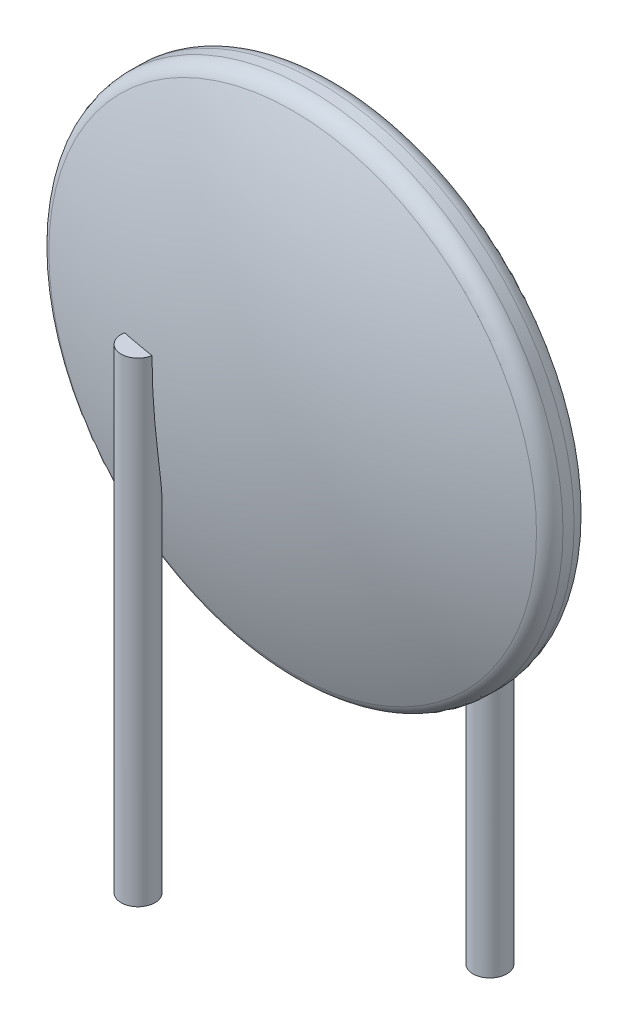
ISO-10303-21;
HEADER;
FILE_DESCRIPTION(('STEP AP214'),'2;1');
FILE_NAME('part.step','',(''),(''),'','','');
FILE_SCHEMA(('AUTOMOTIVE_DESIGN { 1 0 10303 214 1 1 1 1 }'));
ENDSEC;
DATA;
#1=APPLICATION_CONTEXT('core data for automotive mechanical design processes');
#2=APPLICATION_PROTOCOL_DEFINITION('international standard','automotive_design',2000,#1);
#3=PRODUCT_CONTEXT('',#1,'mechanical');
#4=PRODUCT('Part','Part','',(#3));
#5=PRODUCT_RELATED_PRODUCT_CATEGORY('part','',(#4));
#6=PRODUCT_DEFINITION_FORMATION('','',#4);
#7=PRODUCT_DEFINITION_CONTEXT('part definition',#1,'design');
#8=PRODUCT_DEFINITION('design','',#6,#7);
#9=PRODUCT_DEFINITION_SHAPE('','',#8);
#10=(LENGTH_UNIT() NAMED_UNIT(*) SI_UNIT(.MILLI.,.METRE.));
#11=(NAMED_UNIT(*) PLANE_ANGLE_UNIT() SI_UNIT($,.RADIAN.));
#12=(NAMED_UNIT(*) SI_UNIT($,.STERADIAN.) SOLID_ANGLE_UNIT());
#13=UNCERTAINTY_MEASURE_WITH_UNIT(LENGTH_MEASURE(1.E-05),#10,'distance_accuracy_value','');
#14=(GEOMETRIC_REPRESENTATION_CONTEXT(3) GLOBAL_UNCERTAINTY_ASSIGNED_CONTEXT((#13)) GLOBAL_UNIT_ASSIGNED_CONTEXT((#10,
#11,#12)) REPRESENTATION_CONTEXT('',''));
#15=CARTESIAN_POINT('',(0.,0.,0.));
#16=DIRECTION('',(0.,0.,1.));
#17=DIRECTION('',(1.,0.,0.));
#18=AXIS2_PLACEMENT_3D('',#15,#16,#17);
#19=CARTESIAN_POINT('',(0.,-14.,0.));
#20=DIRECTION('',(0.,1.,0.));
#21=DIRECTION('',(0.,0.,1.));
#22=AXIS2_PLACEMENT_3D('',#19,#20,#21);
#23=PLANE('',#22);
#24=CARTESIAN_POINT('',(-3.5,-14.,3.683326093251));
#25=DIRECTION('',(0.,1.,0.));
#26=DIRECTION('',(0.,0.,1.));
#27=AXIS2_PLACEMENT_3D('',#24,#25,#26);
#28=CIRCLE('',#27,0.5);
#29=CARTESIAN_POINT('',(-3.5,-14.,4.183326093251));
#30=VERTEX_POINT('',#29);
#31=EDGE_CURVE('E66',#30,#30,#28,.T.);
#32=ORIENTED_EDGE('',*,*,#31,.F.);
#33=EDGE_LOOP('',(#32));
#34=FACE_BOUND('',#33,.T.);
#35=ADVANCED_FACE('F17',(#34),#23,.F.);
#36=CARTESIAN_POINT('',(-3.5,0.,3.683326093251));
#37=DIRECTION('',(0.,1.,0.));
#38=DIRECTION('',(0.,0.,1.));
#39=AXIS2_PLACEMENT_3D('',#36,#37,#38);
#40=CYLINDRICAL_SURFACE('',#39,0.5);
#41=ORIENTED_EDGE('',*,*,#31,.T.);
#42=EDGE_LOOP('',(#41));
#43=FACE_BOUND('',#42,.T.);
#44=CARTESIAN_POINT('',(-3.5,0.,3.683326093251));
#45=DIRECTION('',(0.,1.,0.));
#46=DIRECTION('',(0.,0.,1.));
#47=AXIS2_PLACEMENT_3D('',#44,#45,#46);
#48=CIRCLE('',#47,0.5);
#49=CARTESIAN_POINT('',(-3.9906891716571,0.,3.58728372333819));
#50=VERTEX_POINT('',#49);
#51=CARTESIAN_POINT('',(-3.00700971065829,0.,3.7667561514721));
#52=VERTEX_POINT('',#51);
#53=EDGE_CURVE('E55',#50,#52,#48,.T.);
#54=ORIENTED_EDGE('',*,*,#53,.F.);
#55=CARTESIAN_POINT('',(-3.00700971065708,0.,3.76675615146499));
#56=CARTESIAN_POINT('',(-3.0070592251256,-0.239811081678179,3.76674767890379));
#57=CARTESIAN_POINT('',(-3.00621259813311,-0.47956267850901,3.76240351238254));
#58=CARTESIAN_POINT('',(-3.00486541035755,-0.739302566449599,3.75291203893592));
#59=CARTESIAN_POINT('',(-3.00475813433634,-0.759444701510805,3.75214478190955));
#60=CARTESIAN_POINT('',(-3.00371758637981,-0.950353461816241,3.74457628746463));
#61=CARTESIAN_POINT('',(-3.00260692799845,-1.1210384372399,3.73556171186832));
#62=CARTESIAN_POINT('',(-3.00074793856268,-1.46214826812452,3.71293470598278));
#63=CARTESIAN_POINT('',(-2.99999970037394,-1.63257304577325,3.69932109876417));
#64=CARTESIAN_POINT('',(-3.00000029243504,-1.96889336274183,3.66771496831553));
#65=CARTESIAN_POINT('',(-3.00071362398686,-2.13479943900794,3.64983538064774));
#66=CARTESIAN_POINT('',(-3.00507921327714,-2.46588005285264,3.60933607712852));
#67=CARTESIAN_POINT('',(-3.00872908139309,-2.63105507548263,3.58672022650128));
#68=CARTESIAN_POINT('',(-3.01821481682134,-2.87811458150513,3.54898399723995));
#69=CARTESIAN_POINT('',(-3.02204640036418,-2.96036717114189,3.53576678109421));
#70=CARTESIAN_POINT('',(-3.03151719165963,-3.12457712849024,3.50799513472799));
#71=CARTESIAN_POINT('',(-3.03715701972241,-3.20653438511846,3.49344024684927));
#72=CARTESIAN_POINT('',(-3.05091864377237,-3.37032626654175,3.46285355029595));
#73=CARTESIAN_POINT('',(-3.05905074560314,-3.45215893686018,3.44681580583883));
#74=CARTESIAN_POINT('',(-3.07878239084277,-3.61503999402156,3.41321197641178));
#75=CARTESIAN_POINT('',(-3.09037859727499,-3.69608905849256,3.39564737375956));
#76=CARTESIAN_POINT('',(-3.11184454356201,-3.81695800105449,3.36793662824601));
#77=CARTESIAN_POINT('',(-3.11971480762932,-3.85727636304615,3.35843512303434));
#78=CARTESIAN_POINT('',(-3.13727409136442,-3.93747520029394,3.33893796833622));
#79=CARTESIAN_POINT('',(-3.14696617635211,-3.97735481584789,3.32894150724827));
#80=CARTESIAN_POINT('',(-3.16878323283047,-4.05613980448162,3.30846373861619));
#81=CARTESIAN_POINT('',(-3.18089657797682,-4.09504887025657,3.29798492555423));
#82=CARTESIAN_POINT('',(-3.20186001523362,-4.15221594245889,3.28184323045006));
#83=CARTESIAN_POINT('',(-3.20930209509203,-4.17104887213027,3.27639932268348));
#84=CARTESIAN_POINT('',(-3.22540650170287,-4.20813447228723,3.26536158109414));
#85=CARTESIAN_POINT('',(-3.23406777516335,-4.22638762714502,3.25976788002425));
#86=CARTESIAN_POINT('',(-3.25312380788255,-4.26213971583301,3.24838122078578));
#87=CARTESIAN_POINT('',(-3.26353370635039,-4.27963021829741,3.24258690755146));
#88=CARTESIAN_POINT('',(-3.28672073449018,-4.31288416996103,3.23090857008006));
#89=CARTESIAN_POINT('',(-3.29948036727393,-4.32865909632307,3.22502548617287));
#90=CARTESIAN_POINT('',(-3.31955734534966,-4.34800213451734,3.21698376361311));
#91=CARTESIAN_POINT('',(-3.32536803746215,-4.35309150931643,3.21476920198868));
#92=CARTESIAN_POINT('',(-3.33759242679954,-4.36253986182098,3.21039248976587));
#93=CARTESIAN_POINT('',(-3.34400654321607,-4.36689832583493,3.20823037693429));
#94=CARTESIAN_POINT('',(-3.35756226748898,-4.3746514801246,3.20399065412846));
#95=CARTESIAN_POINT('',(-3.36471271159778,-4.37803200409085,3.20191462686344));
#96=CARTESIAN_POINT('',(-3.37957139664478,-4.38336607187798,3.19798558187876));
#97=CARTESIAN_POINT('',(-3.38727730958809,-4.38532522945285,3.19613171124764));
#98=CARTESIAN_POINT('',(-3.40232157865398,-4.38743236552548,3.192905072486));
#99=CARTESIAN_POINT('',(-3.40963337258014,-4.38772340974107,3.19150444574472));
#100=CARTESIAN_POINT('',(-3.42422645557374,-4.38683290716573,3.18904559422415));
#101=CARTESIAN_POINT('',(-3.43150772041902,-4.38565035531601,3.18798760375855));
#102=CARTESIAN_POINT('',(-3.44611237088132,-4.38189488193341,3.18618118329614));
#103=CARTESIAN_POINT('',(-3.45342078704104,-4.37925753054465,3.18545018414062));
#104=CARTESIAN_POINT('',(-3.46756901292992,-4.37286016529801,3.18432819396264));
#105=CARTESIAN_POINT('',(-3.47440709490322,-4.3690962584545,3.18393840066522));
#106=CARTESIAN_POINT('',(-3.49164508034788,-4.3581601746311,3.18328166455783));
#107=CARTESIAN_POINT('',(-3.50162462597661,-4.35032174884782,3.18324074142936));
#108=CARTESIAN_POINT('',(-3.52039777793067,-4.33336302052713,3.18365396752202));
#109=CARTESIAN_POINT('',(-3.52918820988885,-4.32423941457886,3.18410941359464));
#110=CARTESIAN_POINT('',(-3.54892956219623,-4.30162658896557,3.18559364554635));
#111=CARTESIAN_POINT('',(-3.55945656160757,-4.28778212623761,3.18677327934215));
#112=CARTESIAN_POINT('',(-3.57916716256999,-4.25924786462843,3.1895337835462));
#113=CARTESIAN_POINT('',(-3.58835147840559,-4.24455852104766,3.19111443938434));
#114=CARTESIAN_POINT('',(-3.60576273704294,-4.21452868236506,3.19455881055538));
#115=CARTESIAN_POINT('',(-3.61398289232902,-4.19918450044662,3.19642434193278));
#116=CARTESIAN_POINT('',(-3.62960544966064,-4.16811863599027,3.20034913058356));
#117=CARTESIAN_POINT('',(-3.63700799904977,-4.1523970220944,3.20240835282698));
#118=CARTESIAN_POINT('',(-3.661489771501,-4.09754095607482,3.2097702055319));
#119=CARTESIAN_POINT('',(-3.67692512103995,-4.05772190264304,3.21542050362153));
#120=CARTESIAN_POINT('',(-3.70521087315429,-3.97719004605075,3.22712559242495));
#121=CARTESIAN_POINT('',(-3.71805631213925,-3.9364756895041,3.23318113076562));
#122=CARTESIAN_POINT('',(-3.74183036469748,-3.85448337384378,3.24549344081269));
#123=CARTESIAN_POINT('',(-3.75275719008664,-3.81320492719506,3.25175039388305));
#124=CARTESIAN_POINT('',(-3.77315954362059,-3.73011052649499,3.26436573405893));
#125=CARTESIAN_POINT('',(-3.7826283021768,-3.68829298768148,3.27072445142253));
#126=CARTESIAN_POINT('',(-3.80033528181156,-3.60445600567161,3.28342945207206));
#127=CARTESIAN_POINT('',(-3.80857507850008,-3.56243689354158,3.28977574080324));
#128=CARTESIAN_POINT('',(-3.82403725464052,-3.478228086016,3.30240782995834));
#129=CARTESIAN_POINT('',(-3.83126016545708,-3.43603849165001,3.30869366036229));
#130=CARTESIAN_POINT('',(-3.85657424680537,-3.27869291574557,3.33191122957267));
#131=CARTESIAN_POINT('',(-3.87195111299003,-3.16305215688407,3.3485269439002));
#132=CARTESIAN_POINT('',(-3.89843511619183,-2.93104497680271,3.38054775972907));
#133=CARTESIAN_POINT('',(-3.90953861228295,-2.814678022253,3.39595182004707));
#134=CARTESIAN_POINT('',(-3.9286280214154,-2.58134867680332,3.4252861251406));
#135=CARTESIAN_POINT('',(-3.9366097579127,-2.46438569886034,3.43921437743071));
#136=CARTESIAN_POINT('',(-3.9502522842617,-2.23001009198165,3.46540348512106));
#137=CARTESIAN_POINT('',(-3.95591046721884,-2.11259710636215,3.47766245743744));
#138=CARTESIAN_POINT('',(-3.96548772179966,-1.87745421440414,3.50036989277371));
#139=CARTESIAN_POINT('',(-3.9694057253901,-1.75972415793005,3.51081724152068));
#140=CARTESIAN_POINT('',(-3.97571851964819,-1.53239040314244,3.52912298006539));
#141=CARTESIAN_POINT('',(-3.97820129489153,-1.42279956950946,3.53711204771452));
#142=CARTESIAN_POINT('',(-3.98232938500204,-1.20356408155124,3.5513660693275));
#143=CARTESIAN_POINT('',(-3.9839752600979,-1.09391951254009,3.55763217536398));
#144=CARTESIAN_POINT('',(-3.98664247302107,-0.874692910352454,3.56839329419133));
#145=CARTESIAN_POINT('',(-3.98766469849102,-0.765111011120696,3.57289082094872));
#146=CARTESIAN_POINT('',(-3.9892400442422,-0.546126212535176,3.58008609734823));
#147=CARTESIAN_POINT('',(-3.98979419186315,-0.436723449925064,3.58278778571224));
#148=CARTESIAN_POINT('',(-3.99051286824745,-0.21821372826253,3.58638507171146));
#149=CARTESIAN_POINT('',(-3.99067855546026,-0.109106861386445,3.58728603819117));
#150=CARTESIAN_POINT('',(-3.99068917165713,0.,3.58728372333839));
#151=B_SPLINE_CURVE_WITH_KNOTS('',3,(#55,#56,#57,#58,#59,#60,#61,#62,#63,#64,#65,#66,#67,#68,
#69,#70,#71,#72,#73,#74,#75,#76,#77,#78,#79,#80,#81,#82,#83,#84,#85,#86,#87,#88,#89,#90,#91,#92,
#93,#94,#95,#96,#97,#98,#99,#100,#101,#102,#103,#104,#105,#106,#107,#108,#109,#110,#111,#112,
#113,#114,#115,#116,#117,#118,#119,#120,#121,#122,#123,#124,#125,#126,#127,#128,#129,#130,#131,
#132,#133,#134,#135,#136,#137,#138,#139,#140,#141,#142,#143,#144,#145,#146,#147,#148,#149,#150),
.UNSPECIFIED.,.F.,.F.,(4,2,2,2,2,2,2,2,2,2,2,2,2,2,2,2,2,2,2,2,2,2,2,2,2,2,2,2,2,2,2,2,2,2,2,2,
2,2,2,2,2,2,2,2,2,2,2,4),(0.,0.719281678061737,0.779752706889144,1.29246368290507,
1.80530596532201,2.30584001867302,2.80596717120091,3.05613212986983,3.30638299849169,
3.5576829744634,3.8087416491993,3.93519947376343,4.06187200709235,4.18795029975535,
4.25082871153622,4.31365313072566,4.37705251132463,4.4399976035835,4.46406227900844,
4.48814379708774,4.51255844428998,4.53687613181244,4.5590728532389,4.58128472211722,
4.60457001195081,4.62793671541105,4.66579138542015,4.70374519499999,4.75591410950639,
4.80805516926266,4.86054368334885,4.91302272281175,5.04208836773961,5.17139906503013,
5.30082964989465,5.43084413248858,5.56069046805111,5.69046869971647,6.0438312305973,
6.39749416457846,6.75162865218117,7.10615938006337,7.46090740113472,7.79061954282076,
8.12011068062717,8.44913175179344,8.77742879540575,9.10474555388431),.UNSPECIFIED.);
#152=EDGE_CURVE('E58',#52,#50,#151,.T.);
#153=ORIENTED_EDGE('',*,*,#152,.F.);
#154=EDGE_LOOP('',(#54,#153));
#155=FACE_BOUND('',#154,.T.);
#156=ADVANCED_FACE('F59',(#43,#155),#40,.T.);
#157=CARTESIAN_POINT('',(0.,0.,0.));
#158=DIRECTION('',(0.,1.,0.));
#159=DIRECTION('',(0.,0.,1.));
#160=AXIS2_PLACEMENT_3D('',#157,#158,#159);
#161=PLANE('',#160);
#162=ORIENTED_EDGE('',*,*,#53,.T.);
#163=CARTESIAN_POINT('',(0.,0.,-15.5));
#164=DIRECTION('',(0.,1.,0.));
#165=DIRECTION('',(0.,0.,1.));
#166=AXIS2_PLACEMENT_3D('',#163,#164,#165);
#167=CIRCLE('',#166,19.5);
#168=EDGE_CURVE('E62',#50,#52,#167,.T.);
#169=ORIENTED_EDGE('',*,*,#168,.F.);
#170=EDGE_LOOP('',(#162,#169));
#171=FACE_BOUND('',#170,.T.);
#172=ADVANCED_FACE('F65',(#171),#161,.T.);
#173=CARTESIAN_POINT('',(0.,0.,-15.5));
#174=DIRECTION('',(0.,1.,0.));
#175=DIRECTION('',(-0.988038776998211,0.,-0.154205626187502));
#176=AXIS2_PLACEMENT_3D('',#173,#174,#175);
#177=SPHERICAL_SURFACE('',#176,19.5);
#178=CARTESIAN_POINT('',(0.,0.,2.62835124227134));
#179=DIRECTION('',(0.,0.,1.));
#180=DIRECTION('',(-0.0123293692752401,0.999923990437911,0.));
#181=AXIS2_PLACEMENT_3D('',#178,#179,#180);
#182=CIRCLE('',#181,7.18421055070426);
#183=CARTESIAN_POINT('',(7.18634412540861E-11,-7.18421051395397,2.62835125683521));
#184=VERTEX_POINT('',#183);
#185=CARTESIAN_POINT('',(0.0885767845300177,-7.18366445762004,2.62835125193614));
#186=VERTEX_POINT('',#185);
#187=EDGE_CURVE('E69',#184,#186,#182,.F.);
#188=ORIENTED_EDGE('',*,*,#187,.F.);
#189=CARTESIAN_POINT('',(7.18661241627672E-11,-7.18421052631606,2.628351251936));
#190=CARTESIAN_POINT('',(0.00369067280767683,-7.18418777357255,2.62836026877927));
#191=CARTESIAN_POINT('',(0.00738134829715723,-7.18416502082904,2.62836815852049));
#192=CARTESIAN_POINT('',(0.0147627089134279,-7.18411951530807,2.62838168381003));
#193=CARTESIAN_POINT('',(0.0184533940402243,-7.18409676253061,2.62838731935498));
#194=CARTESIAN_POINT('',(0.0258347725542505,-7.18405125694173,2.62839633624295));
#195=CARTESIAN_POINT('',(0.0295254659414845,-7.18402850413032,2.62839971758262));
#196=CARTESIAN_POINT('',(0.0369068595995101,-7.18398299847355,2.6284042260521));
#197=CARTESIAN_POINT('',(0.0405975598703038,-7.18396024562818,2.62840535317855));
#198=CARTESIAN_POINT('',(0.0479789659185592,-7.18391473990351,2.62840535321443));
#199=CARTESIAN_POINT('',(0.0516696716960211,-7.1838919870242,2.62840422612049));
#200=CARTESIAN_POINT('',(0.0590510873807184,-7.18384648123163,2.6283997177093));
#201=CARTESIAN_POINT('',(0.0627417972879518,-7.18382372831837,2.6283963363887));
#202=CARTESIAN_POINT('',(0.070123219855292,-7.18377822245789,2.62838731951865));
#203=CARTESIAN_POINT('',(0.0738139325153946,-7.18375546951068,2.62838168396586));
#204=CARTESIAN_POINT('',(0.0811953592115707,-7.18370996358231,2.62836815862699));
#205=CARTESIAN_POINT('',(0.0848860732476381,-7.18368721060116,2.62836026883756));
#206=CARTESIAN_POINT('',(0.0885767845300177,-7.18366445762,2.628351251936));
#207=B_SPLINE_CURVE_WITH_KNOTS('',3,(#189,#190,#191,#192,#193,#194,#195,#196,#197,#198,#199,
#200,#201,#202,#203,#204,#205,#206),.UNSPECIFIED.,.F.,.F.,(4,2,2,2,2,2,2,2,4),(0.,
0.0110722614804626,0.0221445394816789,0.033216834003487,0.0442891450457445,0.0553614726082889,
0.0664338166909607,0.0775061772936012,0.0885785544160552),.UNSPECIFIED.);
#208=EDGE_CURVE('E63',#184,#186,#207,.T.);
#209=ORIENTED_EDGE('',*,*,#208,.T.);
#210=EDGE_LOOP('',(#188,#209));
#211=FACE_BOUND('',#210,.T.);
#212=ORIENTED_EDGE('',*,*,#168,.T.);
#213=ORIENTED_EDGE('',*,*,#152,.T.);
#214=EDGE_LOOP('',(#212,#213));
#215=FACE_BOUND('',#214,.T.);
#216=ADVANCED_FACE('F68',(#211,#215),#177,.T.);
#217=CARTESIAN_POINT('',(0.,-14.,0.));
#218=DIRECTION('',(0.,1.,0.));
#219=DIRECTION('',(0.,0.,1.));
#220=AXIS2_PLACEMENT_3D('',#217,#218,#219);
#221=PLANE('',#220);
#222=CARTESIAN_POINT('',(3.5,-14.,0.3166739067491));
#223=DIRECTION('',(0.,1.,0.));
#224=DIRECTION('',(0.,0.,1.));
#225=AXIS2_PLACEMENT_3D('',#222,#223,#224);
#226=CIRCLE('',#225,0.5);
#227=CARTESIAN_POINT('',(3.5,-14.,0.8166739067491));
#228=VERTEX_POINT('',#227);
#229=EDGE_CURVE('E71',#228,#228,#226,.T.);
#230=ORIENTED_EDGE('',*,*,#229,.F.);
#231=EDGE_LOOP('',(#230));
#232=FACE_BOUND('',#231,.T.);
#233=ADVANCED_FACE('F97',(#232),#221,.F.);
#234=CARTESIAN_POINT('',(0.,0.,2.163521732656));
#235=DIRECTION('',(0.,0.,1.));
#236=DIRECTION('',(-0.0123293692752401,0.999923990437911,0.));
#237=AXIS2_PLACEMENT_3D('',#234,#235,#236);
#238=TOROIDAL_SURFACE('',#237,7.,0.5);
#239=CARTESIAN_POINT('',(0.,0.,2.163521732656));
#240=DIRECTION('',(0.,0.,1.));
#241=DIRECTION('',(1.,0.,0.));
#242=AXIS2_PLACEMENT_3D('',#239,#240,#241);
#243=CIRCLE('',#242,7.5);
#244=CARTESIAN_POINT('',(7.5,0.,2.163521732656));
#245=VERTEX_POINT('',#244);
#246=EDGE_CURVE('E103',#245,#245,#243,.F.);
#247=ORIENTED_EDGE('',*,*,#246,.F.);
#248=EDGE_LOOP('',(#247));
#249=FACE_BOUND('',#248,.T.);
#250=ORIENTED_EDGE('',*,*,#208,.F.);
#251=ORIENTED_EDGE('',*,*,#187,.T.);
#252=EDGE_LOOP('',(#250,#251));
#253=FACE_BOUND('',#252,.T.);
#254=ADVANCED_FACE('F111',(#249,#253),#238,.T.);
#255=CARTESIAN_POINT('',(3.5,0.,0.3166739067491));
#256=DIRECTION('',(0.,1.,0.));
#257=DIRECTION('',(0.,0.,1.));
#258=AXIS2_PLACEMENT_3D('',#255,#256,#257);
#259=CYLINDRICAL_SURFACE('',#258,0.5);
#260=ORIENTED_EDGE('',*,*,#229,.T.);
#261=EDGE_LOOP('',(#260));
#262=FACE_BOUND('',#261,.T.);
#263=CARTESIAN_POINT('',(3.5,0.,0.3166739067491));
#264=DIRECTION('',(0.,1.,0.));
#265=DIRECTION('',(0.,0.,1.));
#266=AXIS2_PLACEMENT_3D('',#263,#264,#265);
#267=CIRCLE('',#266,0.5);
#268=CARTESIAN_POINT('',(3.99068917165716,0.,0.412716276661622));
#269=VERTEX_POINT('',#268);
#270=CARTESIAN_POINT('',(3.00700971065518,0.,0.23324384854636));
#271=VERTEX_POINT('',#270);
#272=EDGE_CURVE('E189',#269,#271,#267,.T.);
#273=ORIENTED_EDGE('',*,*,#272,.F.);
#274=CARTESIAN_POINT('',(3.0070097106571,0.,0.233243848535011));
#275=CARTESIAN_POINT('',(3.0070592201389,-0.23978325344127,0.233252319765931));
#276=CARTESIAN_POINT('',(3.0062127964444,-0.47950705433324,0.237595479905172));
#277=CARTESIAN_POINT('',(3.00486573014014,-0.739242447093531,0.247085678135827));
#278=CARTESIAN_POINT('',(3.00475833423602,-0.75940783301411,0.247853770584155));
#279=CARTESIAN_POINT('',(3.00371765628692,-0.95034211613681,0.255423143011684));
#280=CARTESIAN_POINT('',(3.00260698255308,-1.12102936434752,0.264437747707556));
#281=CARTESIAN_POINT('',(3.00074795811643,-1.46214373675399,0.287064932003987));
#282=CARTESIAN_POINT('',(2.99999970028025,-1.63257078313436,0.300678688590832));
#283=CARTESIAN_POINT('',(3.00000029252257,-1.96889336318516,0.332285031736504));
#284=CARTESIAN_POINT('',(3.00071362401251,-2.13479943971691,0.350164619430991));
#285=CARTESIAN_POINT('',(3.00507921326953,-2.46588005350576,0.390663922959376));
#286=CARTESIAN_POINT('',(3.00872908140193,-2.63105507581662,0.413279773549524));
#287=CARTESIAN_POINT('',(3.01821481682165,-2.87811458146245,0.451016002753624));
#288=CARTESIAN_POINT('',(3.02204640036051,-2.96036717105243,0.464233218891428));
#289=CARTESIAN_POINT('',(3.03151719164754,-3.12457712830763,0.492004865240342));
#290=CARTESIAN_POINT('',(3.03715701970583,-3.20653438488949,0.50655975310966));
#291=CARTESIAN_POINT('',(3.05091864375037,-3.37032626631281,0.537146449659602));
#292=CARTESIAN_POINT('',(3.05905074558298,-3.45215893667711,0.553184194124353));
#293=CARTESIAN_POINT('',(3.07878239082954,-3.61503999393035,0.586788023568428));
#294=CARTESIAN_POINT('',(3.09037859726688,-3.69608905844735,0.60435262623005));
#295=CARTESIAN_POINT('',(3.11184454356274,-3.81695800105906,0.632063371755018));
#296=CARTESIAN_POINT('',(3.11971480763099,-3.85727636305522,0.641564876967776));
#297=CARTESIAN_POINT('',(3.13727409136844,-3.93747520031183,0.661062031668184));
#298=CARTESIAN_POINT('',(3.14696617635753,-3.97735481587009,0.671058492757325));
#299=CARTESIAN_POINT('',(3.16878323283698,-4.05613980450339,0.691536261389616));
#300=CARTESIAN_POINT('',(3.18089657798249,-4.09504887027379,0.702015074450486));
#301=CARTESIAN_POINT('',(3.20186001523755,-4.15221594246944,0.718156769552939));
#302=CARTESIAN_POINT('',(3.20930209509531,-4.17104887213864,0.723600677318938));
#303=CARTESIAN_POINT('',(3.22540650170462,-4.20813447229134,0.734638418907081));
#304=CARTESIAN_POINT('',(3.23406777516421,-4.22638762714705,0.74023211997636));
#305=CARTESIAN_POINT('',(3.25312380788219,-4.2621397158328,0.751618779214109));
#306=CARTESIAN_POINT('',(3.26353370634985,-4.27963021829695,0.757413092448338));
#307=CARTESIAN_POINT('',(3.28672073448953,-4.31288416996065,0.769091429919735));
#308=CARTESIAN_POINT('',(3.29948036727342,-4.32865909632295,0.774974513827022));
#309=CARTESIAN_POINT('',(3.31955734534934,-4.34800213451749,0.78301623638687));
#310=CARTESIAN_POINT('',(3.32536803746183,-4.3530915093166,0.785230798011297));
#311=CARTESIAN_POINT('',(3.33759242679923,-4.36253986182119,0.789607510234127));
#312=CARTESIAN_POINT('',(3.34400654321576,-4.36689832583516,0.791769623065716));
#313=CARTESIAN_POINT('',(3.35756226748869,-4.37465148012488,0.796009345871562));
#314=CARTESIAN_POINT('',(3.3647127115975,-4.37803200409115,0.798085373136585));
#315=CARTESIAN_POINT('',(3.37957139664451,-4.38336607187834,0.802014418121267));
#316=CARTESIAN_POINT('',(3.38727730958783,-4.38532522945324,0.803868288752395));
#317=CARTESIAN_POINT('',(3.40232157865375,-4.3874323655259,0.807094927514051));
#318=CARTESIAN_POINT('',(3.40963337257993,-4.38772340974148,0.80849555425534));
#319=CARTESIAN_POINT('',(3.42422645557356,-4.38683290716617,0.810954405775923));
#320=CARTESIAN_POINT('',(3.43150772041886,-4.38565035531648,0.812012396241542));
#321=CARTESIAN_POINT('',(3.44611237088118,-4.3818948819339,0.813818816703964));
#322=CARTESIAN_POINT('',(3.45342078704089,-4.37925753054515,0.814549815859471));
#323=CARTESIAN_POINT('',(3.46756901292976,-4.37286016529852,0.815671806037449));
#324=CARTESIAN_POINT('',(3.47440709490306,-4.36909625845501,0.816061599334877));
#325=CARTESIAN_POINT('',(3.4916450803477,-4.35816017463165,0.816718335442274));
#326=CARTESIAN_POINT('',(3.50162462597642,-4.35032174884839,0.816759258570741));
#327=CARTESIAN_POINT('',(3.52039777793045,-4.33336302052776,0.81634603247809));
#328=CARTESIAN_POINT('',(3.52918820988862,-4.32423941457953,0.815890586405471));
#329=CARTESIAN_POINT('',(3.54892956219596,-4.30162658896633,0.814406354453772));
#330=CARTESIAN_POINT('',(3.55945656160728,-4.28778212623845,0.813226720657981));
#331=CARTESIAN_POINT('',(3.57916716256965,-4.2592478646294,0.810466216453951));
#332=CARTESIAN_POINT('',(3.58835147840523,-4.24455852104869,0.808885560615823));
#333=CARTESIAN_POINT('',(3.60576273704254,-4.21452868236623,0.805441189444803));
#334=CARTESIAN_POINT('',(3.6139828923286,-4.19918450044785,0.803575658067419));
#335=CARTESIAN_POINT('',(3.6296054496602,-4.16811863599163,0.799650869416663));
#336=CARTESIAN_POINT('',(3.63700799904932,-4.15239702209583,0.797591647173249));
#337=CARTESIAN_POINT('',(3.66148977150048,-4.09754095607654,0.790229794468387));
#338=CARTESIAN_POINT('',(3.67692512103939,-4.05772190264498,0.784579496378784));
#339=CARTESIAN_POINT('',(3.70521087315367,-3.97719004605312,0.77287440757543));
#340=CARTESIAN_POINT('',(3.7180563121386,-3.93647568950669,0.766818869234791));
#341=CARTESIAN_POINT('',(3.74183036469678,-3.85448337384682,0.754506559187792));
#342=CARTESIAN_POINT('',(3.75275719008593,-3.81320492719832,0.748249606117473));
#343=CARTESIAN_POINT('',(3.77315954361984,-3.7301105264987,0.735634265941657));
#344=CARTESIAN_POINT('',(3.78262830217604,-3.68829298768541,0.729275548578085));
#345=CARTESIAN_POINT('',(3.80033528181079,-3.60445600567598,0.716570547928626));
#346=CARTESIAN_POINT('',(3.80857507849929,-3.56243689354617,0.710224259197473));
#347=CARTESIAN_POINT('',(3.82403725463972,-3.47822808602105,0.697592170042438));
#348=CARTESIAN_POINT('',(3.83126016545629,-3.43603849165528,0.691306339638515));
#349=CARTESIAN_POINT('',(3.85657424680472,-3.27869291575087,0.668088770428113));
#350=CARTESIAN_POINT('',(3.87195111298946,-3.16305215688915,0.651473056100538));
#351=CARTESIAN_POINT('',(3.89843511619143,-2.93104497680735,0.619452240271568));
#352=CARTESIAN_POINT('',(3.90953861228261,-2.81467802225741,0.604048179953516));
#353=CARTESIAN_POINT('',(3.92862802141517,-2.58134867680728,0.57471387485989));
#354=CARTESIAN_POINT('',(3.93660975791251,-2.46438569886408,0.560785622569735));
#355=CARTESIAN_POINT('',(3.95025228426158,-2.23001009198493,0.534596514879303));
#356=CARTESIAN_POINT('',(3.95591046721874,-2.1125971063652,0.522337542562872));
#357=CARTESIAN_POINT('',(3.9654877217996,-1.87745421440673,0.499630107226526));
#358=CARTESIAN_POINT('',(3.96940572539006,-1.7597241579324,0.489182758479524));
#359=CARTESIAN_POINT('',(3.97571851964818,-1.53239040314441,0.470877019934761));
#360=CARTESIAN_POINT('',(3.97820129489152,-1.42279956951128,0.462887952285607));
#361=CARTESIAN_POINT('',(3.98232938500204,-1.20356408155278,0.448633930672594));
#362=CARTESIAN_POINT('',(3.9839752600979,-1.09391951254148,0.442367824636107));
#363=CARTESIAN_POINT('',(3.98664247302108,-0.874692910353565,0.43160670580873));
#364=CARTESIAN_POINT('',(3.98766469849103,-0.765111011121665,0.427109179051322));
#365=CARTESIAN_POINT('',(3.98924004424222,-0.546126212535863,0.419913902651791));
#366=CARTESIAN_POINT('',(3.98979419186317,-0.436723449925611,0.417212214287778));
#367=CARTESIAN_POINT('',(3.99051286824747,-0.218213728262801,0.413614928288546));
#368=CARTESIAN_POINT('',(3.99067855546028,-0.109106861386581,0.412713961808837));
#369=CARTESIAN_POINT('',(3.99068917165716,0.,0.412716276661614));
#370=B_SPLINE_CURVE_WITH_KNOTS('',3,(#274,#275,#276,#277,#278,#279,#280,#281,#282,#283,#284,
#285,#286,#287,#288,#289,#290,#291,#292,#293,#294,#295,#296,#297,#298,#299,#300,#301,#302,#303,
#304,#305,#306,#307,#308,#309,#310,#311,#312,#313,#314,#315,#316,#317,#318,#319,#320,#321,#322,
#323,#324,#325,#326,#327,#328,#329,#330,#331,#332,#333,#334,#335,#336,#337,#338,#339,#340,#341,
#342,#343,#344,#345,#346,#347,#348,#349,#350,#351,#352,#353,#354,#355,#356,#357,#358,#359,#360,
#361,#362,#363,#364,#365,#366,#367,#368,#369),.UNSPECIFIED.,.F.,.F.,(4,2,2,2,2,2,2,2,2,2,2,2,2,
2,2,2,2,2,2,2,2,2,2,2,2,2,2,2,2,2,2,2,2,2,2,2,2,2,2,2,2,2,2,2,2,2,2,4),(0.,0.719198262836597,
0.779739089809985,1.29245687847302,1.80530597819748,2.30584003257757,2.80596718407643,
3.05613214260829,3.30638301108626,3.55768298719764,3.80874166207478,3.9351994866531,
4.06187201999601,4.18795031264484,4.25082872441868,4.31365314360113,4.37705252419914,
4.43999761645895,4.46406229188394,4.4881438099633,4.5125584571656,4.5368761446881,
4.55907286611463,4.581284734993,4.60457002482656,4.62793672828679,4.6657913982958,
4.70374520787554,4.75591412238173,4.80805518213781,4.8605436962238,4.91302273568649,
5.04208838061369,5.17139907790355,5.3008296627674,5.43084414536066,5.56069048092253,
5.69046871258721,6.04383124346873,6.39749417745059,6.75162866505399,7.10615939293691,
7.46090741400896,7.79061955569544,8.12011069350229,8.44913176466898,8.77742880828171,
9.10474556676067),.UNSPECIFIED.);
#371=EDGE_CURVE('E85',#271,#269,#370,.T.);
#372=ORIENTED_EDGE('',*,*,#371,.F.);
#373=EDGE_LOOP('',(#273,#372));
#374=FACE_BOUND('',#373,.T.);
#375=ADVANCED_FACE('F120',(#262,#374),#259,.T.);
#376=CARTESIAN_POINT('',(0.,0.,0.));
#377=DIRECTION('',(0.,1.,0.));
#378=DIRECTION('',(0.,0.,1.));
#379=AXIS2_PLACEMENT_3D('',#376,#377,#378);
#380=PLANE('',#379);
#381=ORIENTED_EDGE('',*,*,#272,.T.);
#382=CARTESIAN_POINT('',(0.,0.,19.5));
#383=DIRECTION('',(0.,1.,0.));
#384=DIRECTION('',(0.,0.,1.));
#385=AXIS2_PLACEMENT_3D('',#382,#383,#384);
#386=CIRCLE('',#385,19.5);
#387=EDGE_CURVE('E131',#269,#271,#386,.T.);
#388=ORIENTED_EDGE('',*,*,#387,.F.);
#389=EDGE_LOOP('',(#381,#388));
#390=FACE_BOUND('',#389,.T.);
#391=ADVANCED_FACE('F153',(#390),#380,.T.);
#392=CARTESIAN_POINT('',(0.,0.,0.));
#393=DIRECTION('',(0.,0.,1.));
#394=DIRECTION('',(1.,0.,0.));
#395=AXIS2_PLACEMENT_3D('',#392,#393,#394);
#396=CYLINDRICAL_SURFACE('',#395,7.5);
#397=CARTESIAN_POINT('',(0.,0.,1.836478267344));
#398=DIRECTION('',(0.,0.,1.));
#399=DIRECTION('',(0.999989239270126,-0.00463911025460112,0.));
#400=AXIS2_PLACEMENT_3D('',#397,#398,#399);
#401=CIRCLE('',#400,7.5);
#402=CARTESIAN_POINT('',(7.49991929452595,-0.0347933269095084,1.836478267344));
#403=VERTEX_POINT('',#402);
#404=EDGE_CURVE('E128',#403,#403,#401,.F.);
#405=ORIENTED_EDGE('',*,*,#404,.F.);
#406=EDGE_LOOP('',(#405));
#407=FACE_BOUND('',#406,.T.);
#408=ORIENTED_EDGE('',*,*,#246,.T.);
#409=EDGE_LOOP('',(#408));
#410=FACE_BOUND('',#409,.T.);
#411=ADVANCED_FACE('F145',(#407,#410),#396,.T.);
#412=CARTESIAN_POINT('',(0.,0.,1.836478267344));
#413=DIRECTION('',(0.,0.,1.));
#414=DIRECTION('',(0.999989239270126,-0.00463911025460112,0.));
#415=AXIS2_PLACEMENT_3D('',#412,#413,#414);
#416=TOROIDAL_SURFACE('',#415,7.,0.5);
#417=ORIENTED_EDGE('',*,*,#404,.T.);
#418=EDGE_LOOP('',(#417));
#419=FACE_BOUND('',#418,.T.);
#420=CARTESIAN_POINT('',(0.,0.,1.3716487407143));
#421=DIRECTION('',(0.,0.,1.));
#422=DIRECTION('',(-0.999989239270126,0.00463911025460112,0.));
#423=AXIS2_PLACEMENT_3D('',#420,#421,#422);
#424=CIRCLE('',#423,7.18421050777088);
#425=CARTESIAN_POINT('',(-7.18413324335593,0.0333283448369902,1.37164875772912));
#426=VERTEX_POINT('',#425);
#427=CARTESIAN_POINT('',(-7.18421052494453,1.25757461612699E-11,1.37164874752028));
#428=VERTEX_POINT('',#427);
#429=EDGE_CURVE('E30',#426,#428,#424,.F.);
#430=ORIENTED_EDGE('',*,*,#429,.F.);
#431=CARTESIAN_POINT('',(-7.18421050777078,1.39173955550957E-11,1.37164874071456));
#432=CARTESIAN_POINT('',(-7.18420772563448,0.00138868172430965,1.3716476381624));
#433=CARTESIAN_POINT('',(-7.18420488884587,0.0027773634347019,1.37164667351771));
#434=CARTESIAN_POINT('',(-7.18419910596441,0.00555472679210359,1.37164502004343));
#435=CARTESIAN_POINT('',(-7.18419615987156,0.00694340843911303,1.37164433121383));
#436=CARTESIAN_POINT('',(-7.18419015838201,0.00972077160636338,1.37164322936984));
#437=CARTESIAN_POINT('',(-7.18418710298531,0.0111094531266043,1.37164281635546));
#438=CARTESIAN_POINT('',(-7.18418088288845,0.0138868159769334,1.37164226614203));
#439=CARTESIAN_POINT('',(-7.18417771818829,0.0152754973070215,1.37164212894299));
#440=CARTESIAN_POINT('',(-7.18417127948491,0.0180528597136608,1.37164213036034));
#441=CARTESIAN_POINT('',(-7.18416800548168,0.0194415407902119,1.37164226897674));
#442=CARTESIAN_POINT('',(-7.18416134817259,0.0222189026263915,1.37164282202508));
#443=CARTESIAN_POINT('',(-7.18415796486673,0.0236075833860199,1.37164323645702));
#444=CARTESIAN_POINT('',(-7.18415108895273,0.0263849445249728,1.37164434113652));
#445=CARTESIAN_POINT('',(-7.1841475963446,0.0277736249042972,1.37164503138408));
#446=CARTESIAN_POINT('',(-7.18414050182651,0.0305509852192563,1.37164668769488));
#447=CARTESIAN_POINT('',(-7.18413689991655,0.0319396651548911,1.37164765375813));
#448=CARTESIAN_POINT('',(-7.18413324335589,0.0333283448369901,1.37164875772926));
#449=B_SPLINE_CURVE_WITH_KNOTS('',3,(#431,#432,#433,#434,#435,#436,#437,#438,#439,#440,#441,
#442,#443,#444,#445,#446,#447,#448),.UNSPECIFIED.,.F.,.F.,(4,2,2,2,2,2,2,2,4),(0.,
0.00416605479706141,0.00833210959412627,0.0124981643911894,0.0166642191882498,
0.0208302739853067,0.0249963287823549,0.0291623835794021,0.0333284383764431),.UNSPECIFIED.);
#450=EDGE_CURVE('E11',#428,#426,#449,.T.);
#451=ORIENTED_EDGE('',*,*,#450,.F.);
#452=EDGE_LOOP('',(#430,#451));
#453=FACE_BOUND('',#452,.T.);
#454=ADVANCED_FACE('F141',(#419,#453),#416,.T.);
#455=CARTESIAN_POINT('',(0.,0.,19.5));
#456=DIRECTION('',(0.,1.,0.));
#457=DIRECTION('',(-1.,0.,0.));
#458=AXIS2_PLACEMENT_3D('',#455,#456,#457);
#459=SPHERICAL_SURFACE('',#458,19.5);
#460=ORIENTED_EDGE('',*,*,#450,.T.);
#461=ORIENTED_EDGE('',*,*,#429,.T.);
#462=EDGE_LOOP('',(#460,#461));
#463=FACE_BOUND('',#462,.T.);
#464=ORIENTED_EDGE('',*,*,#387,.T.);
#465=ORIENTED_EDGE('',*,*,#371,.T.);
#466=EDGE_LOOP('',(#464,#465));
#467=FACE_BOUND('',#466,.T.);
#468=ADVANCED_FACE('F163',(#463,#467),#459,.T.);
#469=CLOSED_SHELL('',(#35,#156,#172,#216,#233,#254,#375,#391,#411,#454,#468));
#470=MANIFOLD_SOLID_BREP('B1',#469);
#471=ADVANCED_BREP_SHAPE_REPRESENTATION('',(#18,#470),#14);
#472=SHAPE_DEFINITION_REPRESENTATION(#9,#471);
ENDSEC;
END-ISO-10303-21;
